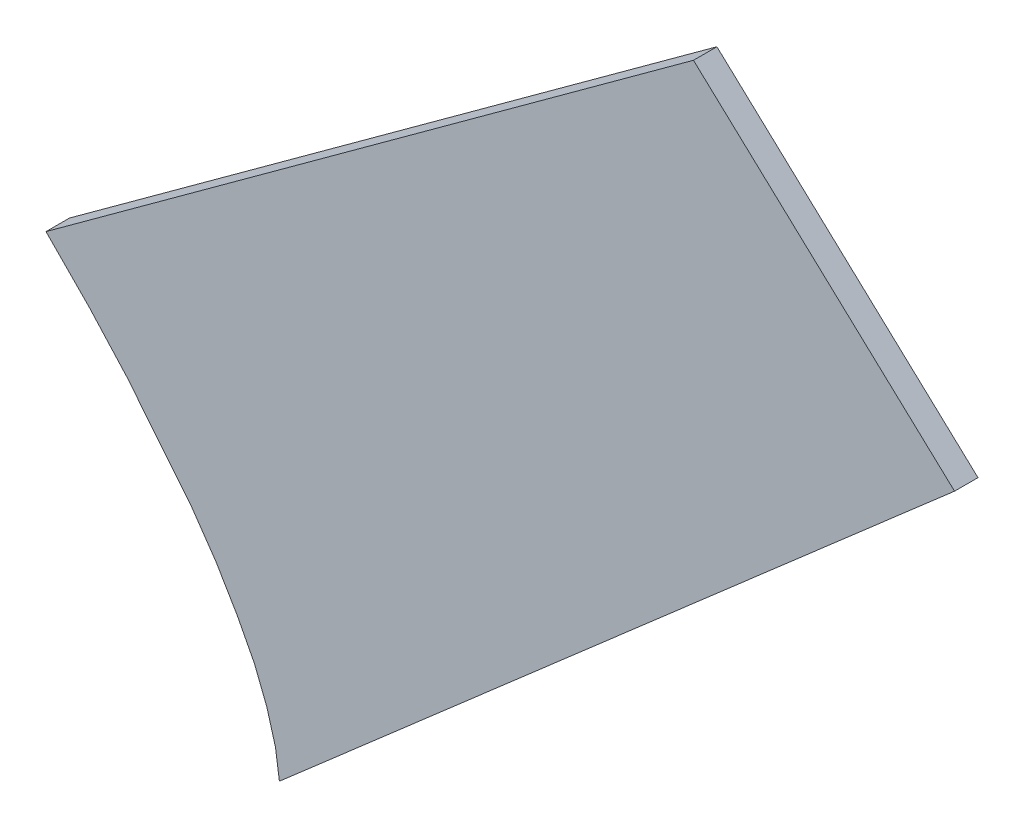
ISO-10303-21;
HEADER;
FILE_DESCRIPTION(('STEP AP214'),'2;1');
FILE_NAME('part.step','',(''),(''),'','','');
FILE_SCHEMA(('AUTOMOTIVE_DESIGN { 1 0 10303 214 1 1 1 1 }'));
ENDSEC;
DATA;
#1=APPLICATION_CONTEXT('core data for automotive mechanical design processes');
#2=APPLICATION_PROTOCOL_DEFINITION('international standard','automotive_design',2000,#1);
#3=PRODUCT_CONTEXT('',#1,'mechanical');
#4=PRODUCT('Part','Part','',(#3));
#5=PRODUCT_RELATED_PRODUCT_CATEGORY('part','',(#4));
#6=PRODUCT_DEFINITION_FORMATION('','',#4);
#7=PRODUCT_DEFINITION_CONTEXT('part definition',#1,'design');
#8=PRODUCT_DEFINITION('design','',#6,#7);
#9=PRODUCT_DEFINITION_SHAPE('','',#8);
#10=(LENGTH_UNIT() NAMED_UNIT(*) SI_UNIT(.MILLI.,.METRE.));
#11=(NAMED_UNIT(*) PLANE_ANGLE_UNIT() SI_UNIT($,.RADIAN.));
#12=(NAMED_UNIT(*) SI_UNIT($,.STERADIAN.) SOLID_ANGLE_UNIT());
#13=UNCERTAINTY_MEASURE_WITH_UNIT(LENGTH_MEASURE(1.E-05),#10,'distance_accuracy_value','');
#14=(GEOMETRIC_REPRESENTATION_CONTEXT(3) GLOBAL_UNCERTAINTY_ASSIGNED_CONTEXT((#13)) GLOBAL_UNIT_ASSIGNED_CONTEXT((#10,
#11,#12)) REPRESENTATION_CONTEXT('',''));
#15=CARTESIAN_POINT('',(0.,0.,0.));
#16=DIRECTION('',(0.,0.,1.));
#17=DIRECTION('',(1.,0.,0.));
#18=AXIS2_PLACEMENT_3D('',#15,#16,#17);
#19=CARTESIAN_POINT('',(84.5080032348633,99.6729965209961,0.));
#20=DIRECTION('',(0.712481288663156,0.701691109609413,0.));
#21=DIRECTION('',(0.701691109609413,-0.712481288663156,0.));
#22=AXIS2_PLACEMENT_3D('',#19,#20,#21);
#23=PLANE('',#22);
#24=DIRECTION('',(0.701691109609413,-0.712481288663156,0.));
#25=VECTOR('',#24,1.);
#26=CARTESIAN_POINT('',(84.5080032348633,99.6729965209961,0.03556));
#27=LINE('',#26,#25);
#28=CARTESIAN_POINT('',(84.5080032348633,99.6729965209961,0.03556));
#29=VERTEX_POINT('',#28);
#30=CARTESIAN_POINT('',(84.572998046875,99.6070022583008,0.03556));
#31=VERTEX_POINT('',#30);
#32=EDGE_CURVE('E11',#29,#31,#27,.T.);
#33=ORIENTED_EDGE('',*,*,#32,.F.);
#34=DIRECTION('',(0.,0.,1.));
#35=VECTOR('',#34,1.);
#36=CARTESIAN_POINT('',(84.5080032348633,99.6729965209961,0.));
#37=LINE('',#36,#35);
#38=CARTESIAN_POINT('',(84.5080032348633,99.6729965209961,0.));
#39=VERTEX_POINT('',#38);
#40=EDGE_CURVE('E24',#39,#29,#37,.T.);
#41=ORIENTED_EDGE('',*,*,#40,.F.);
#42=DIRECTION('',(0.701691109609413,-0.712481288663156,0.));
#43=VECTOR('',#42,1.);
#44=CARTESIAN_POINT('',(84.5080032348633,99.6729965209961,0.));
#45=LINE('',#44,#43);
#46=CARTESIAN_POINT('',(84.572998046875,99.6070022583008,0.));
#47=VERTEX_POINT('',#46);
#48=EDGE_CURVE('E124',#39,#47,#45,.T.);
#49=ORIENTED_EDGE('',*,*,#48,.T.);
#50=DIRECTION('',(0.,0.,1.));
#51=VECTOR('',#50,1.);
#52=CARTESIAN_POINT('',(84.572998046875,99.6070022583008,0.));
#53=LINE('',#52,#51);
#54=EDGE_CURVE('E37',#47,#31,#53,.T.);
#55=ORIENTED_EDGE('',*,*,#54,.T.);
#56=EDGE_LOOP('',(#33,#41,#49,#55));
#57=FACE_BOUND('',#56,.T.);
#58=ADVANCED_FACE('F17',(#57),#23,.F.);
#59=CARTESIAN_POINT('',(84.572998046875,99.6070022583008,0.));
#60=DIRECTION('',(0.741010300732594,0.67149365909753,0.));
#61=DIRECTION('',(0.67149365909753,-0.741010300732594,0.));
#62=AXIS2_PLACEMENT_3D('',#59,#60,#61);
#63=PLANE('',#62);
#64=DIRECTION('',(0.67149365909753,-0.741010300732594,0.));
#65=VECTOR('',#64,1.);
#66=CARTESIAN_POINT('',(84.572998046875,99.6070022583008,0.03556));
#67=LINE('',#66,#65);
#68=CARTESIAN_POINT('',(84.6309967041016,99.5429992675781,0.03556));
#69=VERTEX_POINT('',#68);
#70=EDGE_CURVE('E196',#31,#69,#67,.T.);
#71=ORIENTED_EDGE('',*,*,#70,.F.);
#72=ORIENTED_EDGE('',*,*,#54,.F.);
#73=DIRECTION('',(0.67149365909753,-0.741010300732594,0.));
#74=VECTOR('',#73,1.);
#75=CARTESIAN_POINT('',(84.572998046875,99.6070022583008,0.));
#76=LINE('',#75,#74);
#77=CARTESIAN_POINT('',(84.6309967041016,99.5429992675781,0.));
#78=VERTEX_POINT('',#77);
#79=EDGE_CURVE('E193',#47,#78,#76,.T.);
#80=ORIENTED_EDGE('',*,*,#79,.T.);
#81=DIRECTION('',(0.,0.,1.));
#82=VECTOR('',#81,1.);
#83=CARTESIAN_POINT('',(84.6309967041016,99.5429992675781,0.));
#84=LINE('',#83,#82);
#85=EDGE_CURVE('E191',#78,#69,#84,.T.);
#86=ORIENTED_EDGE('',*,*,#85,.T.);
#87=EDGE_LOOP('',(#71,#72,#80,#86));
#88=FACE_BOUND('',#87,.T.);
#89=ADVANCED_FACE('F204',(#88),#63,.F.);
#90=CARTESIAN_POINT('',(84.6309967041016,99.5429992675781,0.));
#91=DIRECTION('',(0.777704085975787,0.628630539074077,0.));
#92=DIRECTION('',(0.628630539074077,-0.777704085975787,0.));
#93=AXIS2_PLACEMENT_3D('',#90,#91,#92);
#94=PLANE('',#93);
#95=DIRECTION('',(0.628630539074077,-0.777704085975787,0.));
#96=VECTOR('',#95,1.);
#97=CARTESIAN_POINT('',(84.6309967041016,99.5429992675781,0.03556));
#98=LINE('',#97,#96);
#99=CARTESIAN_POINT('',(84.7279968261719,99.4229965209961,0.03556));
#100=VERTEX_POINT('',#99);
#101=EDGE_CURVE('E188',#69,#100,#98,.T.);
#102=ORIENTED_EDGE('',*,*,#101,.F.);
#103=ORIENTED_EDGE('',*,*,#85,.F.);
#104=DIRECTION('',(0.628630539074077,-0.777704085975787,0.));
#105=VECTOR('',#104,1.);
#106=CARTESIAN_POINT('',(84.6309967041016,99.5429992675781,0.));
#107=LINE('',#106,#105);
#108=CARTESIAN_POINT('',(84.7279968261719,99.4229965209961,0.));
#109=VERTEX_POINT('',#108);
#110=EDGE_CURVE('E185',#78,#109,#107,.T.);
#111=ORIENTED_EDGE('',*,*,#110,.T.);
#112=DIRECTION('',(0.,0.,1.));
#113=VECTOR('',#112,1.);
#114=CARTESIAN_POINT('',(84.7279968261719,99.4229965209961,0.));
#115=LINE('',#114,#113);
#116=EDGE_CURVE('E183',#109,#100,#115,.T.);
#117=ORIENTED_EDGE('',*,*,#116,.T.);
#118=EDGE_LOOP('',(#102,#103,#111,#117));
#119=FACE_BOUND('',#118,.T.);
#120=ADVANCED_FACE('F210',(#119),#94,.F.);
#121=CARTESIAN_POINT('',(84.7279968261719,99.4229965209961,0.));
#122=DIRECTION('',(0.822717722740582,0.568450128585218,0.));
#123=DIRECTION('',(0.568450128585218,-0.822717722740582,0.));
#124=AXIS2_PLACEMENT_3D('',#121,#122,#123);
#125=PLANE('',#124);
#126=DIRECTION('',(0.568450128585218,-0.822717722740582,0.));
#127=VECTOR('',#126,1.);
#128=CARTESIAN_POINT('',(84.7279968261719,99.4229965209961,0.03556));
#129=LINE('',#128,#127);
#130=CARTESIAN_POINT('',(84.765998840332,99.3679962158203,0.03556));
#131=VERTEX_POINT('',#130);
#132=EDGE_CURVE('E180',#100,#131,#129,.T.);
#133=ORIENTED_EDGE('',*,*,#132,.F.);
#134=ORIENTED_EDGE('',*,*,#116,.F.);
#135=DIRECTION('',(0.568450128585218,-0.822717722740582,0.));
#136=VECTOR('',#135,1.);
#137=CARTESIAN_POINT('',(84.7279968261719,99.4229965209961,0.));
#138=LINE('',#137,#136);
#139=CARTESIAN_POINT('',(84.765998840332,99.3679962158203,0.));
#140=VERTEX_POINT('',#139);
#141=EDGE_CURVE('E177',#109,#140,#138,.T.);
#142=ORIENTED_EDGE('',*,*,#141,.T.);
#143=DIRECTION('',(0.,0.,1.));
#144=VECTOR('',#143,1.);
#145=CARTESIAN_POINT('',(84.765998840332,99.3679962158203,0.));
#146=LINE('',#145,#144);
#147=EDGE_CURVE('E175',#140,#131,#146,.T.);
#148=ORIENTED_EDGE('',*,*,#147,.T.);
#149=EDGE_LOOP('',(#133,#134,#142,#148));
#150=FACE_BOUND('',#149,.T.);
#151=ADVANCED_FACE('F212',(#150),#125,.F.);
#152=CARTESIAN_POINT('',(84.765998840332,99.3679962158203,0.));
#153=DIRECTION('',(0.860279685935763,0.509822382763119,0.));
#154=DIRECTION('',(0.509822382763119,-0.860279685935763,0.));
#155=AXIS2_PLACEMENT_3D('',#152,#153,#154);
#156=PLANE('',#155);
#157=DIRECTION('',(0.509822382763119,-0.860279685935763,0.));
#158=VECTOR('',#157,1.);
#159=CARTESIAN_POINT('',(84.765998840332,99.3679962158203,0.03556));
#160=LINE('',#159,#158);
#161=CARTESIAN_POINT('',(84.7979965209961,99.3140029907227,0.03556));
#162=VERTEX_POINT('',#161);
#163=EDGE_CURVE('E172',#131,#162,#160,.T.);
#164=ORIENTED_EDGE('',*,*,#163,.F.);
#165=ORIENTED_EDGE('',*,*,#147,.F.);
#166=DIRECTION('',(0.509822382763119,-0.860279685935763,0.));
#167=VECTOR('',#166,1.);
#168=CARTESIAN_POINT('',(84.765998840332,99.3679962158203,0.));
#169=LINE('',#168,#167);
#170=CARTESIAN_POINT('',(84.7979965209961,99.3140029907227,0.));
#171=VERTEX_POINT('',#170);
#172=EDGE_CURVE('E169',#140,#171,#169,.T.);
#173=ORIENTED_EDGE('',*,*,#172,.T.);
#174=DIRECTION('',(0.,0.,1.));
#175=VECTOR('',#174,1.);
#176=CARTESIAN_POINT('',(84.7979965209961,99.3140029907227,0.));
#177=LINE('',#176,#175);
#178=EDGE_CURVE('E167',#171,#162,#177,.T.);
#179=ORIENTED_EDGE('',*,*,#178,.T.);
#180=EDGE_LOOP('',(#164,#165,#173,#179));
#181=FACE_BOUND('',#180,.T.);
#182=ADVANCED_FACE('F217',(#181),#156,.F.);
#183=CARTESIAN_POINT('',(84.7979965209961,99.3140029907227,0.));
#184=DIRECTION('',(0.887221233995669,0.46134421200141,0.));
#185=DIRECTION('',(0.46134421200141,-0.887221233995669,0.));
#186=AXIS2_PLACEMENT_3D('',#183,#184,#185);
#187=PLANE('',#186);
#188=DIRECTION('',(0.46134421200141,-0.887221233995669,0.));
#189=VECTOR('',#188,1.);
#190=CARTESIAN_POINT('',(84.7979965209961,99.3140029907227,0.03556));
#191=LINE('',#190,#189);
#192=CARTESIAN_POINT('',(84.8239974975586,99.2639999389648,0.03556));
#193=VERTEX_POINT('',#192);
#194=EDGE_CURVE('E164',#162,#193,#191,.T.);
#195=ORIENTED_EDGE('',*,*,#194,.F.);
#196=ORIENTED_EDGE('',*,*,#178,.F.);
#197=DIRECTION('',(0.46134421200141,-0.887221233995669,0.));
#198=VECTOR('',#197,1.);
#199=CARTESIAN_POINT('',(84.7979965209961,99.3140029907227,0.));
#200=LINE('',#199,#198);
#201=CARTESIAN_POINT('',(84.8239974975586,99.2639999389648,0.));
#202=VERTEX_POINT('',#201);
#203=EDGE_CURVE('E161',#171,#202,#200,.T.);
#204=ORIENTED_EDGE('',*,*,#203,.T.);
#205=DIRECTION('',(0.,0.,1.));
#206=VECTOR('',#205,1.);
#207=CARTESIAN_POINT('',(84.8239974975586,99.2639999389648,0.));
#208=LINE('',#207,#206);
#209=EDGE_CURVE('E159',#202,#193,#208,.T.);
#210=ORIENTED_EDGE('',*,*,#209,.T.);
#211=EDGE_LOOP('',(#195,#196,#204,#210));
#212=FACE_BOUND('',#211,.T.);
#213=ADVANCED_FACE('F220',(#212),#187,.F.);
#214=CARTESIAN_POINT('',(84.8239974975586,99.2639999389648,0.));
#215=DIRECTION('',(0.929765513623229,0.368152264256154,0.));
#216=DIRECTION('',(0.368152264256154,-0.929765513623229,0.));
#217=AXIS2_PLACEMENT_3D('',#214,#215,#216);
#218=PLANE('',#217);
#219=DIRECTION('',(0.368152264256154,-0.929765513623229,0.));
#220=VECTOR('',#219,1.);
#221=CARTESIAN_POINT('',(84.8239974975586,99.2639999389648,0.03556));
#222=LINE('',#221,#220);
#223=CARTESIAN_POINT('',(84.8430023193359,99.2160034179688,0.03556));
#224=VERTEX_POINT('',#223);
#225=EDGE_CURVE('E156',#193,#224,#222,.T.);
#226=ORIENTED_EDGE('',*,*,#225,.F.);
#227=ORIENTED_EDGE('',*,*,#209,.F.);
#228=DIRECTION('',(0.368152264256154,-0.929765513623229,0.));
#229=VECTOR('',#228,1.);
#230=CARTESIAN_POINT('',(84.8239974975586,99.2639999389648,0.));
#231=LINE('',#230,#229);
#232=CARTESIAN_POINT('',(84.8430023193359,99.2160034179688,0.));
#233=VERTEX_POINT('',#232);
#234=EDGE_CURVE('E153',#202,#233,#231,.T.);
#235=ORIENTED_EDGE('',*,*,#234,.T.);
#236=DIRECTION('',(0.,0.,1.));
#237=VECTOR('',#236,1.);
#238=CARTESIAN_POINT('',(84.8430023193359,99.2160034179688,0.));
#239=LINE('',#238,#237);
#240=EDGE_CURVE('E151',#233,#224,#239,.T.);
#241=ORIENTED_EDGE('',*,*,#240,.T.);
#242=EDGE_LOOP('',(#226,#227,#235,#241));
#243=FACE_BOUND('',#242,.T.);
#244=ADVANCED_FACE('F225',(#243),#218,.F.);
#245=CARTESIAN_POINT('',(84.8430023193359,99.2160034179688,0.));
#246=DIRECTION('',(0.962314850552555,0.271937728912364,0.));
#247=DIRECTION('',(0.271937728912364,-0.962314850552555,0.));
#248=AXIS2_PLACEMENT_3D('',#245,#246,#247);
#249=PLANE('',#248);
#250=DIRECTION('',(0.271937728912364,-0.962314850552555,0.));
#251=VECTOR('',#250,1.);
#252=CARTESIAN_POINT('',(84.8430023193359,99.2160034179688,0.03556));
#253=LINE('',#252,#251);
#254=CARTESIAN_POINT('',(84.8560028076172,99.1699981689453,0.03556));
#255=VERTEX_POINT('',#254);
#256=EDGE_CURVE('E148',#224,#255,#253,.T.);
#257=ORIENTED_EDGE('',*,*,#256,.F.);
#258=ORIENTED_EDGE('',*,*,#240,.F.);
#259=DIRECTION('',(0.271937728912364,-0.962314850552555,0.));
#260=VECTOR('',#259,1.);
#261=CARTESIAN_POINT('',(84.8430023193359,99.2160034179688,0.));
#262=LINE('',#261,#260);
#263=CARTESIAN_POINT('',(84.8560028076172,99.1699981689453,0.));
#264=VERTEX_POINT('',#263);
#265=EDGE_CURVE('E145',#233,#264,#262,.T.);
#266=ORIENTED_EDGE('',*,*,#265,.T.);
#267=DIRECTION('',(0.,0.,1.));
#268=VECTOR('',#267,1.);
#269=CARTESIAN_POINT('',(84.8560028076172,99.1699981689453,0.));
#270=LINE('',#269,#268);
#271=EDGE_CURVE('E143',#264,#255,#270,.T.);
#272=ORIENTED_EDGE('',*,*,#271,.T.);
#273=EDGE_LOOP('',(#257,#258,#266,#272));
#274=FACE_BOUND('',#273,.T.);
#275=ADVANCED_FACE('F228',(#274),#249,.F.);
#276=CARTESIAN_POINT('',(84.8560028076172,99.1699981689453,0.));
#277=DIRECTION('',(0.989960280537772,0.141345827520925,0.));
#278=DIRECTION('',(0.141345827520925,-0.989960280537772,0.));
#279=AXIS2_PLACEMENT_3D('',#276,#277,#278);
#280=PLANE('',#279);
#281=DIRECTION('',(0.141345827520925,-0.989960280537772,0.));
#282=VECTOR('',#281,1.);
#283=CARTESIAN_POINT('',(84.8560028076172,99.1699981689453,0.03556));
#284=LINE('',#283,#282);
#285=CARTESIAN_POINT('',(84.8619995117187,99.1279983520508,0.03556));
#286=VERTEX_POINT('',#285);
#287=EDGE_CURVE('E140',#255,#286,#284,.T.);
#288=ORIENTED_EDGE('',*,*,#287,.F.);
#289=ORIENTED_EDGE('',*,*,#271,.F.);
#290=DIRECTION('',(0.141345827520925,-0.989960280537772,0.));
#291=VECTOR('',#290,1.);
#292=CARTESIAN_POINT('',(84.8560028076172,99.1699981689453,0.));
#293=LINE('',#292,#291);
#294=CARTESIAN_POINT('',(84.8619995117187,99.1279983520508,0.));
#295=VERTEX_POINT('',#294);
#296=EDGE_CURVE('E137',#264,#295,#293,.T.);
#297=ORIENTED_EDGE('',*,*,#296,.T.);
#298=DIRECTION('',(0.,0.,1.));
#299=VECTOR('',#298,1.);
#300=CARTESIAN_POINT('',(84.8619995117187,99.1279983520508,0.));
#301=LINE('',#300,#299);
#302=EDGE_CURVE('E135',#295,#286,#301,.T.);
#303=ORIENTED_EDGE('',*,*,#302,.T.);
#304=EDGE_LOOP('',(#288,#289,#297,#303));
#305=FACE_BOUND('',#304,.T.);
#306=ADVANCED_FACE('F233',(#305),#280,.F.);
#307=CARTESIAN_POINT('',(84.8619995117188,99.1279983520508,0.));
#308=DIRECTION('',(-0.657254629144984,0.753668595914338,0.));
#309=DIRECTION('',(0.753668595914338,0.657254629144984,0.));
#310=AXIS2_PLACEMENT_3D('',#307,#308,#309);
#311=PLANE('',#310);
#312=DIRECTION('',(0.753668595914338,0.657254629144984,0.));
#313=VECTOR('',#312,1.);
#314=CARTESIAN_POINT('',(84.8619995117187,99.1279983520508,0.03556));
#315=LINE('',#314,#313);
#316=CARTESIAN_POINT('',(85.8860015869141,100.021003723145,0.03556));
#317=VERTEX_POINT('',#316);
#318=EDGE_CURVE('E132',#286,#317,#315,.T.);
#319=ORIENTED_EDGE('',*,*,#318,.F.);
#320=ORIENTED_EDGE('',*,*,#302,.F.);
#321=DIRECTION('',(0.753668595914338,0.657254629144984,0.));
#322=VECTOR('',#321,1.);
#323=CARTESIAN_POINT('',(84.8619995117187,99.1279983520508,0.));
#324=LINE('',#323,#322);
#325=CARTESIAN_POINT('',(85.8860015869141,100.021003723145,0.));
#326=VERTEX_POINT('',#325);
#327=EDGE_CURVE('E130',#295,#326,#324,.T.);
#328=ORIENTED_EDGE('',*,*,#327,.T.);
#329=DIRECTION('',(0.,0.,1.));
#330=VECTOR('',#329,1.);
#331=CARTESIAN_POINT('',(85.8860015869141,100.021003723145,0.));
#332=LINE('',#331,#330);
#333=EDGE_CURVE('E115',#326,#317,#332,.T.);
#334=ORIENTED_EDGE('',*,*,#333,.T.);
#335=EDGE_LOOP('',(#319,#320,#328,#334));
#336=FACE_BOUND('',#335,.T.);
#337=ADVANCED_FACE('F235',(#336),#311,.F.);
#338=CARTESIAN_POINT('',(85.8860015869141,100.021003723145,0.));
#339=DIRECTION('',(-0.680727666185453,-0.73253658235593,0.));
#340=DIRECTION('',(-0.73253658235593,0.680727666185453,0.));
#341=AXIS2_PLACEMENT_3D('',#338,#339,#340);
#342=PLANE('',#341);
#343=DIRECTION('',(-0.73253658235593,0.680727666185453,0.));
#344=VECTOR('',#343,1.);
#345=CARTESIAN_POINT('',(85.8860015869141,100.021003723145,0.03556));
#346=LINE('',#345,#344);
#347=CARTESIAN_POINT('',(85.4899978637695,100.388999938965,0.03556));
#348=VERTEX_POINT('',#347);
#349=EDGE_CURVE('E119',#317,#348,#346,.T.);
#350=ORIENTED_EDGE('',*,*,#349,.F.);
#351=ORIENTED_EDGE('',*,*,#333,.F.);
#352=DIRECTION('',(-0.73253658235593,0.680727666185453,0.));
#353=VECTOR('',#352,1.);
#354=CARTESIAN_POINT('',(85.8860015869141,100.021003723145,0.));
#355=LINE('',#354,#353);
#356=CARTESIAN_POINT('',(85.4899978637695,100.388999938965,0.));
#357=VERTEX_POINT('',#356);
#358=EDGE_CURVE('E111',#326,#357,#355,.T.);
#359=ORIENTED_EDGE('',*,*,#358,.T.);
#360=DIRECTION('',(0.,0.,1.));
#361=VECTOR('',#360,1.);
#362=CARTESIAN_POINT('',(85.4899978637695,100.388999938965,0.));
#363=LINE('',#362,#361);
#364=EDGE_CURVE('E101',#357,#348,#363,.T.);
#365=ORIENTED_EDGE('',*,*,#364,.T.);
#366=EDGE_LOOP('',(#350,#351,#359,#365));
#367=FACE_BOUND('',#366,.T.);
#368=ADVANCED_FACE('F114',(#367),#342,.F.);
#369=CARTESIAN_POINT('',(85.4899978637695,100.388999938965,0.));
#370=DIRECTION('',(0.589153713643585,-0.808020978502398,0.));
#371=DIRECTION('',(-0.808020978502398,-0.589153713643585,0.));
#372=AXIS2_PLACEMENT_3D('',#369,#370,#371);
#373=PLANE('',#372);
#374=DIRECTION('',(-0.808020978502398,-0.589153713643585,0.));
#375=VECTOR('',#374,1.);
#376=CARTESIAN_POINT('',(85.4899978637695,100.388999938965,0.03556));
#377=LINE('',#376,#375);
#378=EDGE_CURVE('E107',#348,#29,#377,.T.);
#379=ORIENTED_EDGE('',*,*,#378,.F.);
#380=ORIENTED_EDGE('',*,*,#364,.F.);
#381=DIRECTION('',(-0.808020978502398,-0.589153713643585,0.));
#382=VECTOR('',#381,1.);
#383=CARTESIAN_POINT('',(85.4899978637695,100.388999938965,0.));
#384=LINE('',#383,#382);
#385=EDGE_CURVE('E105',#357,#39,#384,.T.);
#386=ORIENTED_EDGE('',*,*,#385,.T.);
#387=ORIENTED_EDGE('',*,*,#40,.T.);
#388=EDGE_LOOP('',(#379,#380,#386,#387));
#389=FACE_BOUND('',#388,.T.);
#390=ADVANCED_FACE('F103',(#389),#373,.F.);
#391=CARTESIAN_POINT('',(84.5080032348633,99.6729965209961,0.));
#392=DIRECTION('',(0.,0.,1.));
#393=DIRECTION('',(1.,0.,0.));
#394=AXIS2_PLACEMENT_3D('',#391,#392,#393);
#395=PLANE('',#394);
#396=ORIENTED_EDGE('',*,*,#385,.F.);
#397=ORIENTED_EDGE('',*,*,#358,.F.);
#398=ORIENTED_EDGE('',*,*,#327,.F.);
#399=ORIENTED_EDGE('',*,*,#296,.F.);
#400=ORIENTED_EDGE('',*,*,#265,.F.);
#401=ORIENTED_EDGE('',*,*,#234,.F.);
#402=ORIENTED_EDGE('',*,*,#203,.F.);
#403=ORIENTED_EDGE('',*,*,#172,.F.);
#404=ORIENTED_EDGE('',*,*,#141,.F.);
#405=ORIENTED_EDGE('',*,*,#110,.F.);
#406=ORIENTED_EDGE('',*,*,#79,.F.);
#407=ORIENTED_EDGE('',*,*,#48,.F.);
#408=EDGE_LOOP('',(#396,#397,#398,#399,#400,#401,#402,#403,#404,#405,#406,#407));
#409=FACE_BOUND('',#408,.T.);
#410=ADVANCED_FACE('F122',(#409),#395,.F.);
#411=CARTESIAN_POINT('',(84.5080032348633,99.6729965209961,0.03556));
#412=DIRECTION('',(0.,0.,1.));
#413=DIRECTION('',(1.,0.,0.));
#414=AXIS2_PLACEMENT_3D('',#411,#412,#413);
#415=PLANE('',#414);
#416=ORIENTED_EDGE('',*,*,#32,.T.);
#417=ORIENTED_EDGE('',*,*,#70,.T.);
#418=ORIENTED_EDGE('',*,*,#101,.T.);
#419=ORIENTED_EDGE('',*,*,#132,.T.);
#420=ORIENTED_EDGE('',*,*,#163,.T.);
#421=ORIENTED_EDGE('',*,*,#194,.T.);
#422=ORIENTED_EDGE('',*,*,#225,.T.);
#423=ORIENTED_EDGE('',*,*,#256,.T.);
#424=ORIENTED_EDGE('',*,*,#287,.T.);
#425=ORIENTED_EDGE('',*,*,#318,.T.);
#426=ORIENTED_EDGE('',*,*,#349,.T.);
#427=ORIENTED_EDGE('',*,*,#378,.T.);
#428=EDGE_LOOP('',(#416,#417,#418,#419,#420,#421,#422,#423,#424,#425,#426,#427));
#429=FACE_BOUND('',#428,.T.);
#430=ADVANCED_FACE('F207',(#429),#415,.T.);
#431=CLOSED_SHELL('',(#58,#89,#120,#151,#182,#213,#244,#275,#306,#337,#368,#390,#410,#430));
#432=MANIFOLD_SOLID_BREP('B1',#431);
#433=ADVANCED_BREP_SHAPE_REPRESENTATION('',(#18,#432),#14);
#434=SHAPE_DEFINITION_REPRESENTATION(#9,#433);
ENDSEC;
END-ISO-10303-21;
